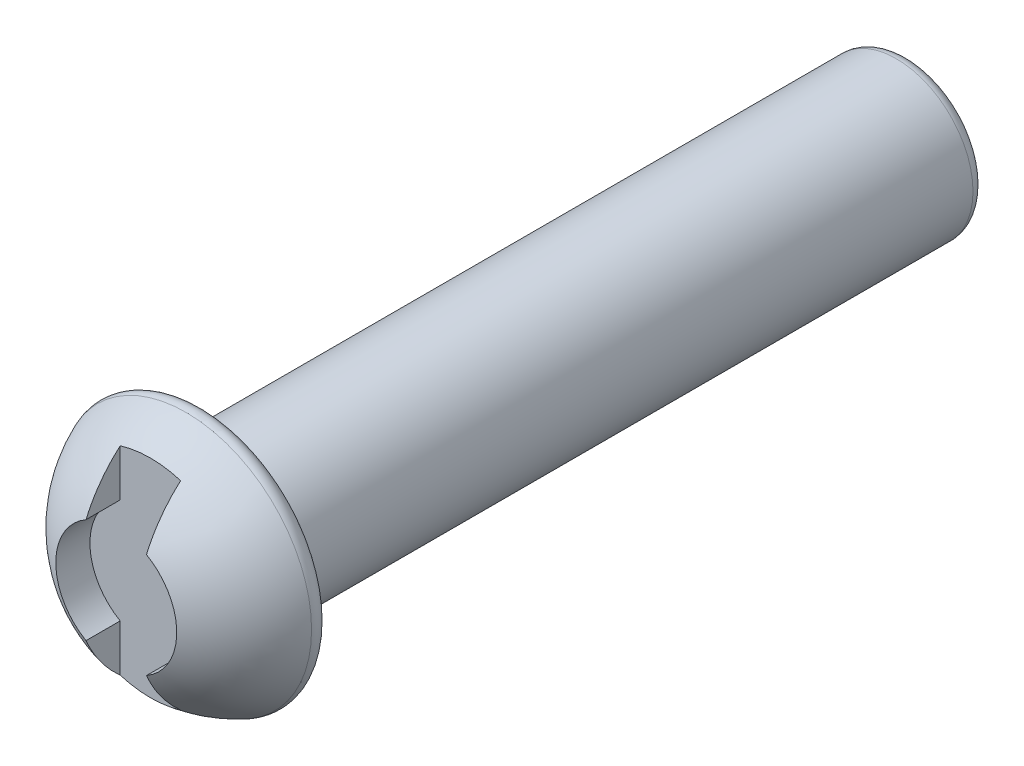
ISO-10303-21;
HEADER;
FILE_DESCRIPTION(('STEP AP214'),'2;1');
FILE_NAME('part.step','',(''),(''),'','','');
FILE_SCHEMA(('AUTOMOTIVE_DESIGN { 1 0 10303 214 1 1 1 1 }'));
ENDSEC;
DATA;
#1=APPLICATION_CONTEXT('core data for automotive mechanical design processes');
#2=APPLICATION_PROTOCOL_DEFINITION('international standard','automotive_design',2000,#1);
#3=PRODUCT_CONTEXT('',#1,'mechanical');
#4=PRODUCT('Part','Part','',(#3));
#5=PRODUCT_RELATED_PRODUCT_CATEGORY('part','',(#4));
#6=PRODUCT_DEFINITION_FORMATION('','',#4);
#7=PRODUCT_DEFINITION_CONTEXT('part definition',#1,'design');
#8=PRODUCT_DEFINITION('design','',#6,#7);
#9=PRODUCT_DEFINITION_SHAPE('','',#8);
#10=(LENGTH_UNIT() NAMED_UNIT(*) SI_UNIT(.MILLI.,.METRE.));
#11=(NAMED_UNIT(*) PLANE_ANGLE_UNIT() SI_UNIT($,.RADIAN.));
#12=(NAMED_UNIT(*) SI_UNIT($,.STERADIAN.) SOLID_ANGLE_UNIT());
#13=UNCERTAINTY_MEASURE_WITH_UNIT(LENGTH_MEASURE(1.E-05),#10,'distance_accuracy_value','');
#14=(GEOMETRIC_REPRESENTATION_CONTEXT(3) GLOBAL_UNCERTAINTY_ASSIGNED_CONTEXT((#13)) GLOBAL_UNIT_ASSIGNED_CONTEXT((#10,
#11,#12)) REPRESENTATION_CONTEXT('',''));
#15=CARTESIAN_POINT('',(0.,0.,0.));
#16=DIRECTION('',(0.,0.,1.));
#17=DIRECTION('',(1.,0.,0.));
#18=AXIS2_PLACEMENT_3D('',#15,#16,#17);
#19=CARTESIAN_POINT('',(0.,0.,-1.68125));
#20=DIRECTION('',(0.,0.,1.));
#21=DIRECTION('',(0.,1.,0.));
#22=AXIS2_PLACEMENT_3D('',#19,#20,#21);
#23=SPHERICAL_SURFACE('',#22,1.68125);
#24=CARTESIAN_POINT('',(0.,0.,-1.0430612244898));
#25=DIRECTION('',(0.,0.,-1.));
#26=DIRECTION('',(-1.,0.,0.));
#27=AXIS2_PLACEMENT_3D('',#24,#25,#26);
#28=CIRCLE('',#27,1.55541526587365);
#29=CARTESIAN_POINT('',(-1.55541526587365,0.,-1.0430612244898));
#30=VERTEX_POINT('',#29);
#31=EDGE_CURVE('E153',#30,#30,#28,.F.);
#32=ORIENTED_EDGE('',*,*,#31,.T.);
#33=EDGE_LOOP('',(#32));
#34=FACE_BOUND('',#33,.T.);
#35=CARTESIAN_POINT('',(0.,0.,-0.176556821142596));
#36=DIRECTION('',(0.,0.,-1.));
#37=DIRECTION('',(-1.,0.,0.));
#38=AXIS2_PLACEMENT_3D('',#35,#36,#37);
#39=CIRCLE('',#38,0.75);
#40=CARTESIAN_POINT('',(-0.375,-0.649519052838329,-0.176556821142596));
#41=VERTEX_POINT('',#40);
#42=CARTESIAN_POINT('',(-0.375,0.649519052838329,-0.176556821142596));
#43=VERTEX_POINT('',#42);
#44=EDGE_CURVE('E68',#41,#43,#39,.T.);
#45=ORIENTED_EDGE('',*,*,#44,.T.);
#46=CARTESIAN_POINT('',(-0.375,0.,-1.68125));
#47=DIRECTION('',(-1.,0.,0.));
#48=DIRECTION('',(0.,-1.,0.));
#49=AXIS2_PLACEMENT_3D('',#46,#47,#48);
#50=CIRCLE('',#49,1.63889492112826);
#51=CARTESIAN_POINT('',(-0.375,1.23161479367536,-0.6));
#52=VERTEX_POINT('',#51);
#53=EDGE_CURVE('E150',#43,#52,#50,.T.);
#54=ORIENTED_EDGE('',*,*,#53,.T.);
#55=CARTESIAN_POINT('',(0.,0.,-0.6));
#56=DIRECTION('',(0.,0.,1.));
#57=DIRECTION('',(1.,0.,0.));
#58=AXIS2_PLACEMENT_3D('',#55,#56,#57);
#59=CIRCLE('',#58,1.28743931895837);
#60=CARTESIAN_POINT('',(0.375,1.23161479367536,-0.6));
#61=VERTEX_POINT('',#60);
#62=EDGE_CURVE('E140',#61,#52,#59,.T.);
#63=ORIENTED_EDGE('',*,*,#62,.F.);
#64=CARTESIAN_POINT('',(0.375,0.,-1.68125));
#65=DIRECTION('',(1.,0.,0.));
#66=DIRECTION('',(0.,1.,0.));
#67=AXIS2_PLACEMENT_3D('',#64,#65,#66);
#68=CIRCLE('',#67,1.63889492112826);
#69=CARTESIAN_POINT('',(0.375,0.649519052838329,-0.176556821142596));
#70=VERTEX_POINT('',#69);
#71=EDGE_CURVE('E146',#61,#70,#68,.T.);
#72=ORIENTED_EDGE('',*,*,#71,.T.);
#73=CARTESIAN_POINT('',(0.,0.,-0.176556821142596));
#74=DIRECTION('',(0.,0.,-1.));
#75=DIRECTION('',(-1.,0.,0.));
#76=AXIS2_PLACEMENT_3D('',#73,#74,#75);
#77=CIRCLE('',#76,0.75);
#78=CARTESIAN_POINT('',(0.374999999999999,-0.649519052838329,-0.176556821142596));
#79=VERTEX_POINT('',#78);
#80=EDGE_CURVE('E144',#70,#79,#77,.T.);
#81=ORIENTED_EDGE('',*,*,#80,.T.);
#82=CARTESIAN_POINT('',(0.375,0.,-1.68125));
#83=DIRECTION('',(1.,0.,0.));
#84=DIRECTION('',(0.,1.,0.));
#85=AXIS2_PLACEMENT_3D('',#82,#83,#84);
#86=CIRCLE('',#85,1.63889492112826);
#87=CARTESIAN_POINT('',(0.375,-1.23161479367536,-0.6));
#88=VERTEX_POINT('',#87);
#89=EDGE_CURVE('E113',#79,#88,#86,.T.);
#90=ORIENTED_EDGE('',*,*,#89,.T.);
#91=CARTESIAN_POINT('',(-0.375,-1.23161479367536,-0.6));
#92=VERTEX_POINT('',#91);
#93=EDGE_CURVE('E106',#92,#88,#59,.T.);
#94=ORIENTED_EDGE('',*,*,#93,.F.);
#95=CARTESIAN_POINT('',(-0.375,0.,-1.68125));
#96=DIRECTION('',(-1.,0.,0.));
#97=DIRECTION('',(0.,-1.,0.));
#98=AXIS2_PLACEMENT_3D('',#95,#96,#97);
#99=CIRCLE('',#98,1.63889492112826);
#100=EDGE_CURVE('E139',#92,#41,#99,.T.);
#101=ORIENTED_EDGE('',*,*,#100,.T.);
#102=EDGE_LOOP('',(#45,#54,#63,#72,#81,#90,#94,#101));
#103=FACE_BOUND('',#102,.T.);
#104=ADVANCED_FACE('F45',(#34,#103),#23,.T.);
#105=CARTESIAN_POINT('',(0.,0.,-10.));
#106=DIRECTION('',(0.,0.,1.));
#107=DIRECTION('',(1.,0.,0.));
#108=AXIS2_PLACEMENT_3D('',#105,#106,#107);
#109=PLANE('',#108);
#110=CARTESIAN_POINT('',(0.,0.,-10.));
#111=DIRECTION('',(0.,0.,1.));
#112=DIRECTION('',(1.,0.,0.));
#113=AXIS2_PLACEMENT_3D('',#110,#111,#112);
#114=CIRCLE('',#113,0.799999999999999);
#115=CARTESIAN_POINT('',(0.799999999999999,0.,-10.));
#116=VERTEX_POINT('',#115);
#117=EDGE_CURVE('E13',#116,#116,#114,.F.);
#118=ORIENTED_EDGE('',*,*,#117,.T.);
#119=EDGE_LOOP('',(#118));
#120=FACE_BOUND('',#119,.T.);
#121=ADVANCED_FACE('F173',(#120),#109,.F.);
#122=CARTESIAN_POINT('',(0.,0.,0.));
#123=DIRECTION('',(0.,0.,1.));
#124=DIRECTION('',(1.,0.,0.));
#125=AXIS2_PLACEMENT_3D('',#122,#123,#124);
#126=CYLINDRICAL_SURFACE('',#125,0.949999999999999);
#127=CARTESIAN_POINT('',(0.,0.,-9.85));
#128=DIRECTION('',(0.,0.,1.));
#129=DIRECTION('',(1.,0.,0.));
#130=AXIS2_PLACEMENT_3D('',#127,#128,#129);
#131=CIRCLE('',#130,0.949999999999999);
#132=CARTESIAN_POINT('',(0.949999999999999,0.,-9.85));
#133=VERTEX_POINT('',#132);
#134=EDGE_CURVE('E53',#133,#133,#131,.T.);
#135=ORIENTED_EDGE('',*,*,#134,.T.);
#136=EDGE_LOOP('',(#135));
#137=FACE_BOUND('',#136,.T.);
#138=CARTESIAN_POINT('',(0.,0.,-1.25));
#139=DIRECTION('',(0.,0.,1.));
#140=DIRECTION('',(1.,0.,0.));
#141=AXIS2_PLACEMENT_3D('',#138,#139,#140);
#142=CIRCLE('',#141,0.949999999999999);
#143=CARTESIAN_POINT('',(0.949999999999999,0.,-1.25));
#144=VERTEX_POINT('',#143);
#145=EDGE_CURVE('E132',#144,#144,#142,.T.);
#146=ORIENTED_EDGE('',*,*,#145,.F.);
#147=EDGE_LOOP('',(#146));
#148=FACE_BOUND('',#147,.T.);
#149=ADVANCED_FACE('F161',(#137,#148),#126,.T.);
#150=CARTESIAN_POINT('',(0.,0.949999999999999,-1.25));
#151=DIRECTION('',(0.,0.,1.));
#152=DIRECTION('',(1.,0.,0.));
#153=AXIS2_PLACEMENT_3D('',#150,#151,#152);
#154=PLANE('',#153);
#155=CARTESIAN_POINT('',(0.,0.,-1.25));
#156=DIRECTION('',(0.,0.,1.));
#157=DIRECTION('',(1.,0.,0.));
#158=AXIS2_PLACEMENT_3D('',#155,#156,#157);
#159=CIRCLE('',#158,1.41664215665072);
#160=CARTESIAN_POINT('',(1.41664215665072,0.,-1.25));
#161=VERTEX_POINT('',#160);
#162=EDGE_CURVE('E156',#161,#161,#159,.F.);
#163=ORIENTED_EDGE('',*,*,#162,.T.);
#164=EDGE_LOOP('',(#163));
#165=FACE_BOUND('',#164,.T.);
#166=ORIENTED_EDGE('',*,*,#145,.T.);
#167=EDGE_LOOP('',(#166));
#168=FACE_BOUND('',#167,.T.);
#169=ADVANCED_FACE('F185',(#165,#168),#154,.F.);
#170=CARTESIAN_POINT('',(0.375,-0.649519052838329,-0.6));
#171=DIRECTION('',(1.,0.,0.));
#172=DIRECTION('',(0.,1.,0.));
#173=AXIS2_PLACEMENT_3D('',#170,#171,#172);
#174=PLANE('',#173);
#175=DIRECTION('',(0.,0.,1.));
#176=VECTOR('',#175,1.);
#177=CARTESIAN_POINT('',(0.374999999999999,-0.649519052838329,-0.6));
#178=LINE('',#177,#176);
#179=CARTESIAN_POINT('',(0.374999999999999,-0.649519052838329,-0.6));
#180=VERTEX_POINT('',#179);
#181=EDGE_CURVE('E111',#180,#79,#178,.T.);
#182=ORIENTED_EDGE('',*,*,#181,.F.);
#183=DIRECTION('',(0.,1.,0.));
#184=VECTOR('',#183,1.);
#185=CARTESIAN_POINT('',(0.375,-0.649519052838329,-0.6));
#186=LINE('',#185,#184);
#187=EDGE_CURVE('E99',#88,#180,#186,.T.);
#188=ORIENTED_EDGE('',*,*,#187,.F.);
#189=ORIENTED_EDGE('',*,*,#89,.F.);
#190=EDGE_LOOP('',(#182,#188,#189));
#191=FACE_BOUND('',#190,.T.);
#192=ADVANCED_FACE('F112',(#191),#174,.F.);
#193=CARTESIAN_POINT('',(-0.375,-0.649519052838329,-0.6));
#194=DIRECTION('',(-1.,0.,0.));
#195=DIRECTION('',(0.,-1.,0.));
#196=AXIS2_PLACEMENT_3D('',#193,#194,#195);
#197=PLANE('',#196);
#198=DIRECTION('',(0.,-1.,0.));
#199=VECTOR('',#198,1.);
#200=CARTESIAN_POINT('',(-0.375,-0.649519052838329,-0.6));
#201=LINE('',#200,#199);
#202=CARTESIAN_POINT('',(-0.375,-0.649519052838329,-0.6));
#203=VERTEX_POINT('',#202);
#204=EDGE_CURVE('E60',#203,#92,#201,.T.);
#205=ORIENTED_EDGE('',*,*,#204,.F.);
#206=DIRECTION('',(0.,0.,1.));
#207=VECTOR('',#206,1.);
#208=CARTESIAN_POINT('',(-0.375,-0.649519052838329,-0.6));
#209=LINE('',#208,#207);
#210=EDGE_CURVE('E130',#203,#41,#209,.T.);
#211=ORIENTED_EDGE('',*,*,#210,.T.);
#212=ORIENTED_EDGE('',*,*,#100,.F.);
#213=EDGE_LOOP('',(#205,#211,#212));
#214=FACE_BOUND('',#213,.T.);
#215=ADVANCED_FACE('F191',(#214),#197,.F.);
#216=CARTESIAN_POINT('',(0.,0.,-0.6));
#217=DIRECTION('',(0.,0.,1.));
#218=DIRECTION('',(1.,0.,0.));
#219=AXIS2_PLACEMENT_3D('',#216,#217,#218);
#220=CYLINDRICAL_SURFACE('',#219,0.75);
#221=ORIENTED_EDGE('',*,*,#210,.F.);
#222=CARTESIAN_POINT('',(0.,0.,-0.6));
#223=DIRECTION('',(0.,0.,1.));
#224=DIRECTION('',(1.,0.,0.));
#225=AXIS2_PLACEMENT_3D('',#222,#223,#224);
#226=CIRCLE('',#225,0.75);
#227=CARTESIAN_POINT('',(-0.375,0.649519052838329,-0.6));
#228=VERTEX_POINT('',#227);
#229=EDGE_CURVE('E127',#228,#203,#226,.T.);
#230=ORIENTED_EDGE('',*,*,#229,.F.);
#231=DIRECTION('',(0.,0.,1.));
#232=VECTOR('',#231,1.);
#233=CARTESIAN_POINT('',(-0.375,0.649519052838329,-0.6));
#234=LINE('',#233,#232);
#235=EDGE_CURVE('E133',#228,#43,#234,.T.);
#236=ORIENTED_EDGE('',*,*,#235,.T.);
#237=ORIENTED_EDGE('',*,*,#44,.F.);
#238=EDGE_LOOP('',(#221,#230,#236,#237));
#239=FACE_BOUND('',#238,.T.);
#240=ADVANCED_FACE('F201',(#239),#220,.F.);
#241=CARTESIAN_POINT('',(-0.375,1.8086388695011,-0.6));
#242=DIRECTION('',(-1.,0.,0.));
#243=DIRECTION('',(0.,-1.,0.));
#244=AXIS2_PLACEMENT_3D('',#241,#242,#243);
#245=PLANE('',#244);
#246=ORIENTED_EDGE('',*,*,#235,.F.);
#247=DIRECTION('',(0.,-1.,0.));
#248=VECTOR('',#247,1.);
#249=CARTESIAN_POINT('',(-0.375,1.8086388695011,-0.6));
#250=LINE('',#249,#248);
#251=EDGE_CURVE('E123',#52,#228,#250,.T.);
#252=ORIENTED_EDGE('',*,*,#251,.F.);
#253=ORIENTED_EDGE('',*,*,#53,.F.);
#254=EDGE_LOOP('',(#246,#252,#253));
#255=FACE_BOUND('',#254,.T.);
#256=ADVANCED_FACE('F197',(#255),#245,.F.);
#257=CARTESIAN_POINT('',(0.375,1.8086388695011,-0.6));
#258=DIRECTION('',(1.,0.,0.));
#259=DIRECTION('',(0.,1.,0.));
#260=AXIS2_PLACEMENT_3D('',#257,#258,#259);
#261=PLANE('',#260);
#262=DIRECTION('',(0.,1.,0.));
#263=VECTOR('',#262,1.);
#264=CARTESIAN_POINT('',(0.375,1.8086388695011,-0.6));
#265=LINE('',#264,#263);
#266=CARTESIAN_POINT('',(0.375,0.649519052838329,-0.6));
#267=VERTEX_POINT('',#266);
#268=EDGE_CURVE('E121',#267,#61,#265,.T.);
#269=ORIENTED_EDGE('',*,*,#268,.F.);
#270=DIRECTION('',(0.,0.,1.));
#271=VECTOR('',#270,1.);
#272=CARTESIAN_POINT('',(0.375,0.649519052838329,-0.6));
#273=LINE('',#272,#271);
#274=EDGE_CURVE('E116',#267,#70,#273,.T.);
#275=ORIENTED_EDGE('',*,*,#274,.T.);
#276=ORIENTED_EDGE('',*,*,#71,.F.);
#277=EDGE_LOOP('',(#269,#275,#276));
#278=FACE_BOUND('',#277,.T.);
#279=ADVANCED_FACE('F194',(#278),#261,.F.);
#280=CARTESIAN_POINT('',(0.,0.,-0.6));
#281=DIRECTION('',(0.,0.,1.));
#282=DIRECTION('',(1.,0.,0.));
#283=AXIS2_PLACEMENT_3D('',#280,#281,#282);
#284=CYLINDRICAL_SURFACE('',#283,0.75);
#285=ORIENTED_EDGE('',*,*,#274,.F.);
#286=CARTESIAN_POINT('',(0.,0.,-0.6));
#287=DIRECTION('',(0.,0.,1.));
#288=DIRECTION('',(1.,0.,0.));
#289=AXIS2_PLACEMENT_3D('',#286,#287,#288);
#290=CIRCLE('',#289,0.75);
#291=EDGE_CURVE('E104',#180,#267,#290,.T.);
#292=ORIENTED_EDGE('',*,*,#291,.F.);
#293=ORIENTED_EDGE('',*,*,#181,.T.);
#294=ORIENTED_EDGE('',*,*,#80,.F.);
#295=EDGE_LOOP('',(#285,#292,#293,#294));
#296=FACE_BOUND('',#295,.T.);
#297=ADVANCED_FACE('F118',(#296),#284,.F.);
#298=CARTESIAN_POINT('',(0.,0.,-0.6));
#299=DIRECTION('',(0.,0.,1.));
#300=DIRECTION('',(1.,0.,0.));
#301=AXIS2_PLACEMENT_3D('',#298,#299,#300);
#302=PLANE('',#301);
#303=ORIENTED_EDGE('',*,*,#62,.T.);
#304=ORIENTED_EDGE('',*,*,#251,.T.);
#305=ORIENTED_EDGE('',*,*,#229,.T.);
#306=ORIENTED_EDGE('',*,*,#204,.T.);
#307=ORIENTED_EDGE('',*,*,#93,.T.);
#308=ORIENTED_EDGE('',*,*,#187,.T.);
#309=ORIENTED_EDGE('',*,*,#291,.T.);
#310=ORIENTED_EDGE('',*,*,#268,.T.);
#311=EDGE_LOOP('',(#303,#304,#305,#306,#307,#308,#309,#310));
#312=FACE_BOUND('',#311,.T.);
#313=ADVANCED_FACE('F101',(#312),#302,.T.);
#314=CARTESIAN_POINT('',(0.,0.,-1.1));
#315=DIRECTION('',(0.,0.,1.));
#316=DIRECTION('',(1.,0.,0.));
#317=AXIS2_PLACEMENT_3D('',#314,#315,#316);
#318=TOROIDAL_SURFACE('',#317,1.41664215665072,0.15);
#319=ORIENTED_EDGE('',*,*,#162,.F.);
#320=EDGE_LOOP('',(#319));
#321=FACE_BOUND('',#320,.T.);
#322=ORIENTED_EDGE('',*,*,#31,.F.);
#323=EDGE_LOOP('',(#322));
#324=FACE_BOUND('',#323,.T.);
#325=ADVANCED_FACE('F165',(#321,#324),#318,.T.);
#326=CARTESIAN_POINT('',(0.,0.,-9.85));
#327=DIRECTION('',(0.,0.,1.));
#328=DIRECTION('',(1.,0.,0.));
#329=AXIS2_PLACEMENT_3D('',#326,#327,#328);
#330=TOROIDAL_SURFACE('',#329,0.799999999999999,0.15);
#331=ORIENTED_EDGE('',*,*,#117,.F.);
#332=EDGE_LOOP('',(#331));
#333=FACE_BOUND('',#332,.T.);
#334=ORIENTED_EDGE('',*,*,#134,.F.);
#335=EDGE_LOOP('',(#334));
#336=FACE_BOUND('',#335,.T.);
#337=ADVANCED_FACE('F47',(#333,#336),#330,.T.);
#338=CLOSED_SHELL('',(#104,#121,#149,#169,#192,#215,#240,#256,#279,#297,#313,#325,#337));
#339=MANIFOLD_SOLID_BREP('B2',#338);
#340=ADVANCED_BREP_SHAPE_REPRESENTATION('',(#18,#339),#14);
#341=SHAPE_DEFINITION_REPRESENTATION(#9,#340);
ENDSEC;
END-ISO-10303-21;
